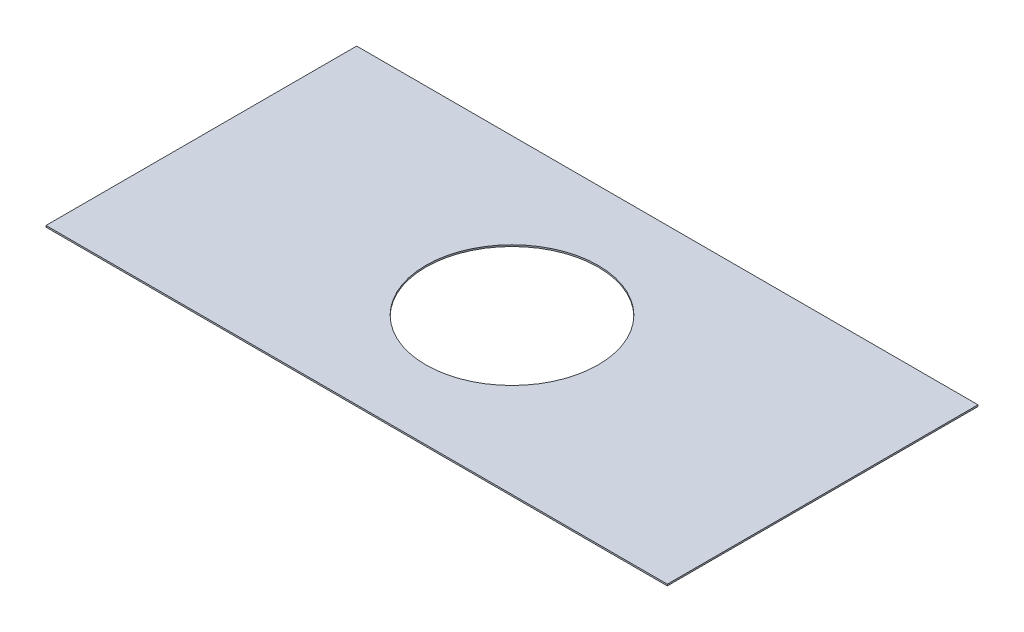
ISO-10303-21;
HEADER;
FILE_DESCRIPTION(('STEP AP214'),'2;1');
FILE_NAME('part.step','',(''),(''),'','','');
FILE_SCHEMA(('AUTOMOTIVE_DESIGN { 1 0 10303 214 1 1 1 1 }'));
ENDSEC;
DATA;
#1=APPLICATION_CONTEXT('core data for automotive mechanical design processes');
#2=APPLICATION_PROTOCOL_DEFINITION('international standard','automotive_design',2000,#1);
#3=PRODUCT_CONTEXT('',#1,'mechanical');
#4=PRODUCT('Part','Part','',(#3));
#5=PRODUCT_RELATED_PRODUCT_CATEGORY('part','',(#4));
#6=PRODUCT_DEFINITION_FORMATION('','',#4);
#7=PRODUCT_DEFINITION_CONTEXT('part definition',#1,'design');
#8=PRODUCT_DEFINITION('design','',#6,#7);
#9=PRODUCT_DEFINITION_SHAPE('','',#8);
#10=(LENGTH_UNIT() NAMED_UNIT(*) SI_UNIT(.MILLI.,.METRE.));
#11=(NAMED_UNIT(*) PLANE_ANGLE_UNIT() SI_UNIT($,.RADIAN.));
#12=(NAMED_UNIT(*) SI_UNIT($,.STERADIAN.) SOLID_ANGLE_UNIT());
#13=UNCERTAINTY_MEASURE_WITH_UNIT(LENGTH_MEASURE(1.E-05),#10,'distance_accuracy_value','');
#14=(GEOMETRIC_REPRESENTATION_CONTEXT(3) GLOBAL_UNCERTAINTY_ASSIGNED_CONTEXT((#13)) GLOBAL_UNIT_ASSIGNED_CONTEXT((#10,
#11,#12)) REPRESENTATION_CONTEXT('',''));
#15=CARTESIAN_POINT('',(0.,0.,0.));
#16=DIRECTION('',(0.,0.,1.));
#17=DIRECTION('',(1.,0.,0.));
#18=AXIS2_PLACEMENT_3D('',#15,#16,#17);
#19=CARTESIAN_POINT('',(0.,0.1,0.));
#20=DIRECTION('',(0.,1.,0.));
#21=DIRECTION('',(0.,0.,1.));
#22=AXIS2_PLACEMENT_3D('',#19,#20,#21);
#23=PLANE('',#22);
#24=DIRECTION('',(0.,0.,-1.));
#25=VECTOR('',#24,1.);
#26=CARTESIAN_POINT('',(20.,0.1,-10.));
#27=LINE('',#26,#25);
#28=CARTESIAN_POINT('',(20.,0.1,10.));
#29=VERTEX_POINT('',#28);
#30=CARTESIAN_POINT('',(20.,0.1,-10.));
#31=VERTEX_POINT('',#30);
#32=EDGE_CURVE('E85',#29,#31,#27,.T.);
#33=ORIENTED_EDGE('',*,*,#32,.T.);
#34=DIRECTION('',(-1.,0.,0.));
#35=VECTOR('',#34,1.);
#36=CARTESIAN_POINT('',(-20.,0.1,-10.));
#37=LINE('',#36,#35);
#38=CARTESIAN_POINT('',(-20.,0.1,-10.));
#39=VERTEX_POINT('',#38);
#40=EDGE_CURVE('E80',#31,#39,#37,.T.);
#41=ORIENTED_EDGE('',*,*,#40,.T.);
#42=DIRECTION('',(0.,0.,1.));
#43=VECTOR('',#42,1.);
#44=CARTESIAN_POINT('',(-20.,0.1,-10.));
#45=LINE('',#44,#43);
#46=CARTESIAN_POINT('',(-20.,0.1,10.));
#47=VERTEX_POINT('',#46);
#48=EDGE_CURVE('E83',#39,#47,#45,.T.);
#49=ORIENTED_EDGE('',*,*,#48,.T.);
#50=DIRECTION('',(1.,0.,0.));
#51=VECTOR('',#50,1.);
#52=CARTESIAN_POINT('',(-20.,0.1,10.));
#53=LINE('',#52,#51);
#54=EDGE_CURVE('E50',#47,#29,#53,.T.);
#55=ORIENTED_EDGE('',*,*,#54,.T.);
#56=EDGE_LOOP('',(#33,#41,#49,#55));
#57=FACE_BOUND('',#56,.T.);
#58=CARTESIAN_POINT('',(0.,0.1,0.));
#59=DIRECTION('',(0.,1.,0.));
#60=DIRECTION('',(0.,0.,1.));
#61=AXIS2_PLACEMENT_3D('',#58,#59,#60);
#62=CIRCLE('',#61,5.54891831017947);
#63=CARTESIAN_POINT('',(0.,0.1,5.54891831017947));
#64=VERTEX_POINT('',#63);
#65=EDGE_CURVE('E100',#64,#64,#62,.T.);
#66=ORIENTED_EDGE('',*,*,#65,.F.);
#67=EDGE_LOOP('',(#66));
#68=FACE_BOUND('',#67,.T.);
#69=ADVANCED_FACE('F33',(#57,#68),#23,.T.);
#70=CARTESIAN_POINT('',(0.,0.,0.));
#71=DIRECTION('',(0.,1.,0.));
#72=DIRECTION('',(0.,0.,1.));
#73=AXIS2_PLACEMENT_3D('',#70,#71,#72);
#74=PLANE('',#73);
#75=DIRECTION('',(0.,0.,-1.));
#76=VECTOR('',#75,1.);
#77=CARTESIAN_POINT('',(20.,0.,-10.));
#78=LINE('',#77,#76);
#79=CARTESIAN_POINT('',(20.,0.,10.));
#80=VERTEX_POINT('',#79);
#81=CARTESIAN_POINT('',(20.,0.,-10.));
#82=VERTEX_POINT('',#81);
#83=EDGE_CURVE('E97',#80,#82,#78,.T.);
#84=ORIENTED_EDGE('',*,*,#83,.F.);
#85=DIRECTION('',(1.,0.,0.));
#86=VECTOR('',#85,1.);
#87=CARTESIAN_POINT('',(-20.,0.,10.));
#88=LINE('',#87,#86);
#89=CARTESIAN_POINT('',(-20.,0.,10.));
#90=VERTEX_POINT('',#89);
#91=EDGE_CURVE('E73',#90,#80,#88,.T.);
#92=ORIENTED_EDGE('',*,*,#91,.F.);
#93=DIRECTION('',(0.,0.,1.));
#94=VECTOR('',#93,1.);
#95=CARTESIAN_POINT('',(-20.,0.,-10.));
#96=LINE('',#95,#94);
#97=CARTESIAN_POINT('',(-20.,0.,-10.));
#98=VERTEX_POINT('',#97);
#99=EDGE_CURVE('E67',#98,#90,#96,.T.);
#100=ORIENTED_EDGE('',*,*,#99,.F.);
#101=DIRECTION('',(-1.,0.,0.));
#102=VECTOR('',#101,1.);
#103=CARTESIAN_POINT('',(-20.,0.,-10.));
#104=LINE('',#103,#102);
#105=EDGE_CURVE('E89',#82,#98,#104,.T.);
#106=ORIENTED_EDGE('',*,*,#105,.F.);
#107=EDGE_LOOP('',(#84,#92,#100,#106));
#108=FACE_BOUND('',#107,.T.);
#109=CARTESIAN_POINT('',(0.,0.,0.));
#110=DIRECTION('',(0.,1.,0.));
#111=DIRECTION('',(0.,0.,1.));
#112=AXIS2_PLACEMENT_3D('',#109,#110,#111);
#113=CIRCLE('',#112,5.54891831017947);
#114=CARTESIAN_POINT('',(0.,0.,5.54891831017947));
#115=VERTEX_POINT('',#114);
#116=EDGE_CURVE('E112',#115,#115,#113,.T.);
#117=ORIENTED_EDGE('',*,*,#116,.T.);
#118=EDGE_LOOP('',(#117));
#119=FACE_BOUND('',#118,.T.);
#120=ADVANCED_FACE('F108',(#108,#119),#74,.F.);
#121=CARTESIAN_POINT('',(20.,0.1,-10.));
#122=DIRECTION('',(-1.,0.,0.));
#123=DIRECTION('',(0.,0.,1.));
#124=AXIS2_PLACEMENT_3D('',#121,#122,#123);
#125=PLANE('',#124);
#126=ORIENTED_EDGE('',*,*,#83,.T.);
#127=DIRECTION('',(0.,-1.,0.));
#128=VECTOR('',#127,1.);
#129=CARTESIAN_POINT('',(20.,0.1,-10.));
#130=LINE('',#129,#128);
#131=EDGE_CURVE('E11',#31,#82,#130,.T.);
#132=ORIENTED_EDGE('',*,*,#131,.F.);
#133=ORIENTED_EDGE('',*,*,#32,.F.);
#134=DIRECTION('',(0.,-1.,0.));
#135=VECTOR('',#134,1.);
#136=CARTESIAN_POINT('',(20.,0.1,10.));
#137=LINE('',#136,#135);
#138=EDGE_CURVE('E93',#29,#80,#137,.T.);
#139=ORIENTED_EDGE('',*,*,#138,.T.);
#140=EDGE_LOOP('',(#126,#132,#133,#139));
#141=FACE_BOUND('',#140,.T.);
#142=ADVANCED_FACE('F35',(#141),#125,.F.);
#143=CARTESIAN_POINT('',(-20.,0.1,-10.));
#144=DIRECTION('',(0.,0.,1.));
#145=DIRECTION('',(1.,0.,0.));
#146=AXIS2_PLACEMENT_3D('',#143,#144,#145);
#147=PLANE('',#146);
#148=ORIENTED_EDGE('',*,*,#105,.T.);
#149=DIRECTION('',(0.,-1.,0.));
#150=VECTOR('',#149,1.);
#151=CARTESIAN_POINT('',(-20.,0.1,-10.));
#152=LINE('',#151,#150);
#153=EDGE_CURVE('E42',#39,#98,#152,.T.);
#154=ORIENTED_EDGE('',*,*,#153,.F.);
#155=ORIENTED_EDGE('',*,*,#40,.F.);
#156=ORIENTED_EDGE('',*,*,#131,.T.);
#157=EDGE_LOOP('',(#148,#154,#155,#156));
#158=FACE_BOUND('',#157,.T.);
#159=ADVANCED_FACE('F88',(#158),#147,.F.);
#160=CARTESIAN_POINT('',(-20.,0.1,-10.));
#161=DIRECTION('',(1.,0.,0.));
#162=DIRECTION('',(0.,0.,-1.));
#163=AXIS2_PLACEMENT_3D('',#160,#161,#162);
#164=PLANE('',#163);
#165=ORIENTED_EDGE('',*,*,#99,.T.);
#166=DIRECTION('',(0.,-1.,0.));
#167=VECTOR('',#166,1.);
#168=CARTESIAN_POINT('',(-20.,0.1,10.));
#169=LINE('',#168,#167);
#170=EDGE_CURVE('E90',#47,#90,#169,.T.);
#171=ORIENTED_EDGE('',*,*,#170,.F.);
#172=ORIENTED_EDGE('',*,*,#48,.F.);
#173=ORIENTED_EDGE('',*,*,#153,.T.);
#174=EDGE_LOOP('',(#165,#171,#172,#173));
#175=FACE_BOUND('',#174,.T.);
#176=ADVANCED_FACE('F91',(#175),#164,.F.);
#177=CARTESIAN_POINT('',(-20.,0.1,10.));
#178=DIRECTION('',(0.,0.,-1.));
#179=DIRECTION('',(-1.,0.,0.));
#180=AXIS2_PLACEMENT_3D('',#177,#178,#179);
#181=PLANE('',#180);
#182=ORIENTED_EDGE('',*,*,#91,.T.);
#183=ORIENTED_EDGE('',*,*,#138,.F.);
#184=ORIENTED_EDGE('',*,*,#54,.F.);
#185=ORIENTED_EDGE('',*,*,#170,.T.);
#186=EDGE_LOOP('',(#182,#183,#184,#185));
#187=FACE_BOUND('',#186,.T.);
#188=ADVANCED_FACE('F105',(#187),#181,.F.);
#189=CARTESIAN_POINT('',(0.,0.1,0.));
#190=DIRECTION('',(0.,-1.,0.));
#191=DIRECTION('',(0.,0.,-1.));
#192=AXIS2_PLACEMENT_3D('',#189,#190,#191);
#193=CYLINDRICAL_SURFACE('',#192,5.54891831017947);
#194=ORIENTED_EDGE('',*,*,#65,.T.);
#195=EDGE_LOOP('',(#194));
#196=FACE_BOUND('',#195,.T.);
#197=ORIENTED_EDGE('',*,*,#116,.F.);
#198=EDGE_LOOP('',(#197));
#199=FACE_BOUND('',#198,.T.);
#200=ADVANCED_FACE('F118',(#196,#199),#193,.F.);
#201=CLOSED_SHELL('',(#69,#120,#142,#159,#176,#188,#200));
#202=MANIFOLD_SOLID_BREP('B2',#201);
#203=ADVANCED_BREP_SHAPE_REPRESENTATION('',(#18,#202),#14);
#204=SHAPE_DEFINITION_REPRESENTATION(#9,#203);
ENDSEC;
END-ISO-10303-21;
